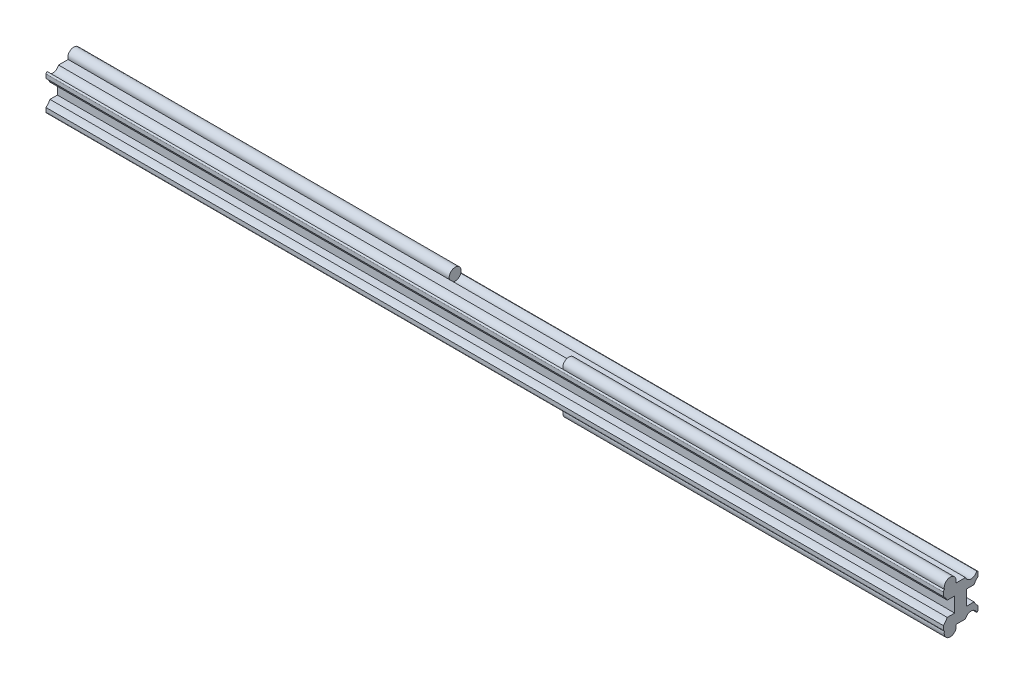
ISO-10303-21;
HEADER;
FILE_DESCRIPTION(('STEP AP214'),'2;1');
FILE_NAME('part.step','',(''),(''),'','','');
FILE_SCHEMA(('AUTOMOTIVE_DESIGN { 1 0 10303 214 1 1 1 1 }'));
ENDSEC;
DATA;
#1=APPLICATION_CONTEXT('core data for automotive mechanical design processes');
#2=APPLICATION_PROTOCOL_DEFINITION('international standard','automotive_design',2000,#1);
#3=PRODUCT_CONTEXT('',#1,'mechanical');
#4=PRODUCT('Part','Part','',(#3));
#5=PRODUCT_RELATED_PRODUCT_CATEGORY('part','',(#4));
#6=PRODUCT_DEFINITION_FORMATION('','',#4);
#7=PRODUCT_DEFINITION_CONTEXT('part definition',#1,'design');
#8=PRODUCT_DEFINITION('design','',#6,#7);
#9=PRODUCT_DEFINITION_SHAPE('','',#8);
#10=(LENGTH_UNIT() NAMED_UNIT(*) SI_UNIT(.MILLI.,.METRE.));
#11=(NAMED_UNIT(*) PLANE_ANGLE_UNIT() SI_UNIT($,.RADIAN.));
#12=(NAMED_UNIT(*) SI_UNIT($,.STERADIAN.) SOLID_ANGLE_UNIT());
#13=UNCERTAINTY_MEASURE_WITH_UNIT(LENGTH_MEASURE(1.E-05),#10,'distance_accuracy_value','');
#14=(GEOMETRIC_REPRESENTATION_CONTEXT(3) GLOBAL_UNCERTAINTY_ASSIGNED_CONTEXT((#13)) GLOBAL_UNIT_ASSIGNED_CONTEXT((#10,
#11,#12)) REPRESENTATION_CONTEXT('',''));
#15=CARTESIAN_POINT('',(0.,0.,0.));
#16=DIRECTION('',(0.,0.,1.));
#17=DIRECTION('',(1.,0.,0.));
#18=AXIS2_PLACEMENT_3D('',#15,#16,#17);
#19=CARTESIAN_POINT('',(40.,-6.65,3.5));
#20=DIRECTION('',(-1.,0.,0.));
#21=DIRECTION('',(0.,0.,1.));
#22=AXIS2_PLACEMENT_3D('',#19,#20,#21);
#23=CYLINDRICAL_SURFACE('',#22,2.);
#24=CARTESIAN_POINT('',(22.5,-6.65,3.5));
#25=DIRECTION('',(1.,0.,0.));
#26=DIRECTION('',(0.,0.,-1.));
#27=AXIS2_PLACEMENT_3D('',#24,#25,#26);
#28=CIRCLE('',#27,2.);
#29=CARTESIAN_POINT('',(22.5,-6.,1.60857196806222));
#30=VERTEX_POINT('',#29);
#31=CARTESIAN_POINT('',(22.5,-5.99207212544615,5.38868496893607));
#32=VERTEX_POINT('',#31);
#33=EDGE_CURVE('E31',#30,#32,#28,.T.);
#34=ORIENTED_EDGE('',*,*,#33,.T.);
#35=DIRECTION('',(-1.,0.,0.));
#36=VECTOR('',#35,1.);
#37=CARTESIAN_POINT('',(0.,-5.99207212544615,5.38868496893607));
#38=LINE('',#37,#36);
#39=CARTESIAN_POINT('',(-150.,-5.99207212544615,5.38868496893607));
#40=VERTEX_POINT('',#39);
#41=EDGE_CURVE('E219',#32,#40,#38,.T.);
#42=ORIENTED_EDGE('',*,*,#41,.T.);
#43=CARTESIAN_POINT('',(-150.,-6.65,3.5));
#44=DIRECTION('',(1.,0.,0.));
#45=DIRECTION('',(0.,0.,1.));
#46=AXIS2_PLACEMENT_3D('',#43,#44,#45);
#47=CIRCLE('',#46,2.);
#48=CARTESIAN_POINT('',(-150.,-6.,1.60857196806222));
#49=VERTEX_POINT('',#48);
#50=EDGE_CURVE('E260',#49,#40,#47,.T.);
#51=ORIENTED_EDGE('',*,*,#50,.F.);
#52=DIRECTION('',(-1.,0.,0.));
#53=VECTOR('',#52,1.);
#54=CARTESIAN_POINT('',(40.,-6.,1.60857196806222));
#55=LINE('',#54,#53);
#56=EDGE_CURVE('E320',#49,#30,#55,.F.);
#57=ORIENTED_EDGE('',*,*,#56,.T.);
#58=EDGE_LOOP('',(#34,#42,#51,#57));
#59=FACE_BOUND('',#58,.T.);
#60=ADVANCED_FACE('F16',(#59),#23,.F.);
#61=CARTESIAN_POINT('',(40.,6.65,3.5));
#62=DIRECTION('',(-1.,0.,0.));
#63=DIRECTION('',(0.,0.,1.));
#64=AXIS2_PLACEMENT_3D('',#61,#62,#63);
#65=CYLINDRICAL_SURFACE('',#64,2.);
#66=CARTESIAN_POINT('',(22.5,6.65,3.5));
#67=DIRECTION('',(1.,0.,0.));
#68=DIRECTION('',(0.,0.,-1.));
#69=AXIS2_PLACEMENT_3D('',#66,#67,#68);
#70=CIRCLE('',#69,2.);
#71=CARTESIAN_POINT('',(22.5,5.99207212544615,5.38868496893607));
#72=VERTEX_POINT('',#71);
#73=CARTESIAN_POINT('',(22.5,6.,1.60857196806223));
#74=VERTEX_POINT('',#73);
#75=EDGE_CURVE('E232',#72,#74,#70,.T.);
#76=ORIENTED_EDGE('',*,*,#75,.T.);
#77=DIRECTION('',(-1.,0.,0.));
#78=VECTOR('',#77,1.);
#79=CARTESIAN_POINT('',(40.,6.,1.60857196806223));
#80=LINE('',#79,#78);
#81=CARTESIAN_POINT('',(-150.,6.,1.60857196806223));
#82=VERTEX_POINT('',#81);
#83=EDGE_CURVE('E24',#74,#82,#80,.T.);
#84=ORIENTED_EDGE('',*,*,#83,.T.);
#85=CARTESIAN_POINT('',(-150.,6.65,3.5));
#86=DIRECTION('',(1.,0.,0.));
#87=DIRECTION('',(0.,0.,1.));
#88=AXIS2_PLACEMENT_3D('',#85,#86,#87);
#89=CIRCLE('',#88,2.);
#90=CARTESIAN_POINT('',(-150.,5.99207212544615,5.38868496893607));
#91=VERTEX_POINT('',#90);
#92=EDGE_CURVE('E290',#91,#82,#89,.T.);
#93=ORIENTED_EDGE('',*,*,#92,.F.);
#94=DIRECTION('',(-1.,0.,0.));
#95=VECTOR('',#94,1.);
#96=CARTESIAN_POINT('',(0.,5.99207212544615,5.38868496893607));
#97=LINE('',#96,#95);
#98=EDGE_CURVE('E384',#91,#72,#97,.F.);
#99=ORIENTED_EDGE('',*,*,#98,.T.);
#100=EDGE_LOOP('',(#76,#84,#93,#99));
#101=FACE_BOUND('',#100,.T.);
#102=ADVANCED_FACE('F489',(#101),#65,.F.);
#103=CARTESIAN_POINT('',(40.,-6.65,-3.5));
#104=DIRECTION('',(-1.,0.,0.));
#105=DIRECTION('',(0.,0.,1.));
#106=AXIS2_PLACEMENT_3D('',#103,#104,#105);
#107=CYLINDRICAL_SURFACE('',#106,2.);
#108=CARTESIAN_POINT('',(-22.5,-6.65,-3.5));
#109=DIRECTION('',(-1.,0.,0.));
#110=DIRECTION('',(0.,0.,1.));
#111=AXIS2_PLACEMENT_3D('',#108,#109,#110);
#112=CIRCLE('',#111,2.);
#113=CARTESIAN_POINT('',(-22.5,-6.,-1.60857196806223));
#114=VERTEX_POINT('',#113);
#115=CARTESIAN_POINT('',(-22.5,-5.99207212544615,-5.38868496893607));
#116=VERTEX_POINT('',#115);
#117=EDGE_CURVE('E241',#114,#116,#112,.T.);
#118=ORIENTED_EDGE('',*,*,#117,.T.);
#119=DIRECTION('',(-1.,0.,0.));
#120=VECTOR('',#119,1.);
#121=CARTESIAN_POINT('',(0.,-5.99207212544615,-5.38868496893607));
#122=LINE('',#121,#120);
#123=CARTESIAN_POINT('',(150.,-5.99207212544615,-5.38868496893607));
#124=VERTEX_POINT('',#123);
#125=EDGE_CURVE('E378',#116,#124,#122,.F.);
#126=ORIENTED_EDGE('',*,*,#125,.T.);
#127=CARTESIAN_POINT('',(150.,-6.65,-3.5));
#128=DIRECTION('',(1.,0.,0.));
#129=DIRECTION('',(0.,0.,1.));
#130=AXIS2_PLACEMENT_3D('',#127,#128,#129);
#131=CIRCLE('',#130,2.);
#132=CARTESIAN_POINT('',(150.,-6.,-1.60857196806223));
#133=VERTEX_POINT('',#132);
#134=EDGE_CURVE('E323',#124,#133,#131,.T.);
#135=ORIENTED_EDGE('',*,*,#134,.T.);
#136=DIRECTION('',(-1.,0.,0.));
#137=VECTOR('',#136,1.);
#138=CARTESIAN_POINT('',(40.,-6.,-1.60857196806223));
#139=LINE('',#138,#137);
#140=EDGE_CURVE('E419',#133,#114,#139,.T.);
#141=ORIENTED_EDGE('',*,*,#140,.T.);
#142=EDGE_LOOP('',(#118,#126,#135,#141));
#143=FACE_BOUND('',#142,.T.);
#144=ADVANCED_FACE('F494',(#143),#107,.F.);
#145=CARTESIAN_POINT('',(40.,6.65,-3.5));
#146=DIRECTION('',(-1.,0.,0.));
#147=DIRECTION('',(0.,0.,1.));
#148=AXIS2_PLACEMENT_3D('',#145,#146,#147);
#149=CYLINDRICAL_SURFACE('',#148,2.);
#150=CARTESIAN_POINT('',(-22.5,6.65,-3.5));
#151=DIRECTION('',(-1.,0.,0.));
#152=DIRECTION('',(0.,0.,1.));
#153=AXIS2_PLACEMENT_3D('',#150,#151,#152);
#154=CIRCLE('',#153,2.);
#155=CARTESIAN_POINT('',(-22.5,5.99207212544615,-5.38868496893607));
#156=VERTEX_POINT('',#155);
#157=CARTESIAN_POINT('',(-22.5,6.,-1.60857196806223));
#158=VERTEX_POINT('',#157);
#159=EDGE_CURVE('E247',#156,#158,#154,.T.);
#160=ORIENTED_EDGE('',*,*,#159,.T.);
#161=DIRECTION('',(-1.,0.,0.));
#162=VECTOR('',#161,1.);
#163=CARTESIAN_POINT('',(40.,6.,-1.60857196806223));
#164=LINE('',#163,#162);
#165=CARTESIAN_POINT('',(150.,6.,-1.60857196806223));
#166=VERTEX_POINT('',#165);
#167=EDGE_CURVE('E381',#158,#166,#164,.F.);
#168=ORIENTED_EDGE('',*,*,#167,.T.);
#169=CARTESIAN_POINT('',(150.,6.65,-3.5));
#170=DIRECTION('',(1.,0.,0.));
#171=DIRECTION('',(0.,0.,1.));
#172=AXIS2_PLACEMENT_3D('',#169,#170,#171);
#173=CIRCLE('',#172,2.);
#174=CARTESIAN_POINT('',(150.,5.99207212544615,-5.38868496893607));
#175=VERTEX_POINT('',#174);
#176=EDGE_CURVE('E351',#166,#175,#173,.T.);
#177=ORIENTED_EDGE('',*,*,#176,.T.);
#178=DIRECTION('',(-1.,0.,0.));
#179=VECTOR('',#178,1.);
#180=CARTESIAN_POINT('',(0.,5.99207212544615,-5.38868496893607));
#181=LINE('',#180,#179);
#182=EDGE_CURVE('E422',#175,#156,#181,.T.);
#183=ORIENTED_EDGE('',*,*,#182,.T.);
#184=EDGE_LOOP('',(#160,#168,#177,#183));
#185=FACE_BOUND('',#184,.T.);
#186=ADVANCED_FACE('F501',(#185),#149,.F.);
#187=CARTESIAN_POINT('',(-150.,-5.5,-5.3000000020087));
#188=DIRECTION('',(-1.,0.,0.));
#189=DIRECTION('',(0.,0.,1.));
#190=AXIS2_PLACEMENT_3D('',#187,#188,#189);
#191=PLANE('',#190);
#192=CARTESIAN_POINT('',(-150.,-5.5,-5.3000000020087));
#193=DIRECTION('',(-1.,0.,0.));
#194=DIRECTION('',(0.,0.,1.));
#195=AXIS2_PLACEMENT_3D('',#192,#193,#194);
#196=CIRCLE('',#195,0.5);
#197=CARTESIAN_POINT('',(-150.,-5.5,-5.8000000020087));
#198=VERTEX_POINT('',#197);
#199=CARTESIAN_POINT('',(-150.,-5.99207212544615,-5.38868496893607));
#200=VERTEX_POINT('',#199);
#201=EDGE_CURVE('E253',#198,#200,#196,.T.);
#202=ORIENTED_EDGE('',*,*,#201,.T.);
#203=CARTESIAN_POINT('',(-150.,-6.65,-3.5));
#204=DIRECTION('',(-1.,0.,0.));
#205=DIRECTION('',(0.,0.,1.));
#206=AXIS2_PLACEMENT_3D('',#203,#204,#205);
#207=CIRCLE('',#206,2.);
#208=CARTESIAN_POINT('',(-150.,-6.,-1.60857196806223));
#209=VERTEX_POINT('',#208);
#210=EDGE_CURVE('E240',#200,#209,#207,.T.);
#211=ORIENTED_EDGE('',*,*,#210,.T.);
#212=DIRECTION('',(0.,0.,1.));
#213=VECTOR('',#212,1.);
#214=CARTESIAN_POINT('',(-150.,-6.,-1.60857196806223));
#215=LINE('',#214,#213);
#216=EDGE_CURVE('E256',#209,#49,#215,.T.);
#217=ORIENTED_EDGE('',*,*,#216,.T.);
#218=ORIENTED_EDGE('',*,*,#50,.T.);
#219=CARTESIAN_POINT('',(-150.,-5.5,5.3000000020087));
#220=DIRECTION('',(-1.,0.,0.));
#221=DIRECTION('',(0.,0.,1.));
#222=AXIS2_PLACEMENT_3D('',#219,#220,#221);
#223=CIRCLE('',#222,0.5);
#224=CARTESIAN_POINT('',(-150.,-5.5,5.8000000020087));
#225=VERTEX_POINT('',#224);
#226=EDGE_CURVE('E263',#40,#225,#223,.T.);
#227=ORIENTED_EDGE('',*,*,#226,.T.);
#228=DIRECTION('',(0.,1.,0.));
#229=VECTOR('',#228,1.);
#230=CARTESIAN_POINT('',(-150.,-5.5,5.8000000020087));
#231=LINE('',#230,#229);
#232=CARTESIAN_POINT('',(-150.,-4.1995699145586,5.80000000200865));
#233=VERTEX_POINT('',#232);
#234=EDGE_CURVE('E266',#225,#233,#231,.T.);
#235=ORIENTED_EDGE('',*,*,#234,.T.);
#236=CARTESIAN_POINT('',(-150.,0.00400000029354697,9.49999999808304));
#237=DIRECTION('',(1.,0.,0.));
#238=DIRECTION('',(0.,0.,1.));
#239=AXIS2_PLACEMENT_3D('',#236,#237,#238);
#240=CIRCLE('',#239,5.6);
#241=CARTESIAN_POINT('',(-150.,-2.49600003169351,4.48901208749444));
#242=VERTEX_POINT('',#241);
#243=EDGE_CURVE('E269',#233,#242,#240,.T.);
#244=ORIENTED_EDGE('',*,*,#243,.T.);
#245=DIRECTION('',(0.,1.2851330311388E-08,-1.));
#246=VECTOR('',#245,1.);
#247=CARTESIAN_POINT('',(-150.,-2.49600003169351,4.48901208749444));
#248=LINE('',#247,#246);
#249=CARTESIAN_POINT('',(-150.,-2.4959999997064,1.99999999773326));
#250=VERTEX_POINT('',#249);
#251=EDGE_CURVE('E272',#242,#250,#248,.T.);
#252=ORIENTED_EDGE('',*,*,#251,.T.);
#253=DIRECTION('',(0.,1.,0.));
#254=VECTOR('',#253,1.);
#255=CARTESIAN_POINT('',(-150.,-2.4959999997064,1.99999999773326));
#256=LINE('',#255,#254);
#257=CARTESIAN_POINT('',(-150.,2.4959999997064,1.99999999773326));
#258=VERTEX_POINT('',#257);
#259=EDGE_CURVE('E275',#250,#258,#256,.T.);
#260=ORIENTED_EDGE('',*,*,#259,.T.);
#261=DIRECTION('',(0.,1.28513155011446E-08,1.));
#262=VECTOR('',#261,1.);
#263=CARTESIAN_POINT('',(-150.,2.4959999997064,1.99999999773326));
#264=LINE('',#263,#262);
#265=CARTESIAN_POINT('',(-150.,2.49600003169349,4.48901208749451));
#266=VERTEX_POINT('',#265);
#267=EDGE_CURVE('E278',#258,#266,#264,.T.);
#268=ORIENTED_EDGE('',*,*,#267,.T.);
#269=CARTESIAN_POINT('',(-150.,-0.00400000029354697,9.49999999808304));
#270=DIRECTION('',(1.,0.,0.));
#271=DIRECTION('',(0.,0.,1.));
#272=AXIS2_PLACEMENT_3D('',#269,#270,#271);
#273=CIRCLE('',#272,5.6);
#274=CARTESIAN_POINT('',(-150.,4.19956991455855,5.8000000020087));
#275=VERTEX_POINT('',#274);
#276=EDGE_CURVE('E281',#266,#275,#273,.T.);
#277=ORIENTED_EDGE('',*,*,#276,.T.);
#278=DIRECTION('',(0.,1.,0.));
#279=VECTOR('',#278,1.);
#280=CARTESIAN_POINT('',(-150.,4.19956991455855,5.8000000020087));
#281=LINE('',#280,#279);
#282=CARTESIAN_POINT('',(-150.,5.5,5.8000000020087));
#283=VERTEX_POINT('',#282);
#284=EDGE_CURVE('E284',#275,#283,#281,.T.);
#285=ORIENTED_EDGE('',*,*,#284,.T.);
#286=CARTESIAN_POINT('',(-150.,5.5,5.3000000020087));
#287=DIRECTION('',(-1.,0.,0.));
#288=DIRECTION('',(0.,0.,1.));
#289=AXIS2_PLACEMENT_3D('',#286,#287,#288);
#290=CIRCLE('',#289,0.5);
#291=EDGE_CURVE('E287',#283,#91,#290,.T.);
#292=ORIENTED_EDGE('',*,*,#291,.T.);
#293=ORIENTED_EDGE('',*,*,#92,.T.);
#294=DIRECTION('',(0.,0.,-1.));
#295=VECTOR('',#294,1.);
#296=CARTESIAN_POINT('',(-150.,6.,1.60857196806223));
#297=LINE('',#296,#295);
#298=CARTESIAN_POINT('',(-150.,6.,-1.60857196806223));
#299=VERTEX_POINT('',#298);
#300=EDGE_CURVE('E293',#82,#299,#297,.T.);
#301=ORIENTED_EDGE('',*,*,#300,.T.);
#302=CARTESIAN_POINT('',(-150.,6.65,-3.5));
#303=DIRECTION('',(-1.,0.,0.));
#304=DIRECTION('',(0.,0.,1.));
#305=AXIS2_PLACEMENT_3D('',#302,#303,#304);
#306=CIRCLE('',#305,2.);
#307=CARTESIAN_POINT('',(-150.,5.99207212544615,-5.38868496893607));
#308=VERTEX_POINT('',#307);
#309=EDGE_CURVE('E244',#299,#308,#306,.T.);
#310=ORIENTED_EDGE('',*,*,#309,.T.);
#311=CARTESIAN_POINT('',(-150.,5.5,-5.3000000020087));
#312=DIRECTION('',(-1.,0.,0.));
#313=DIRECTION('',(0.,0.,1.));
#314=AXIS2_PLACEMENT_3D('',#311,#312,#313);
#315=CIRCLE('',#314,0.5);
#316=CARTESIAN_POINT('',(-150.,5.5,-5.8000000020087));
#317=VERTEX_POINT('',#316);
#318=EDGE_CURVE('E296',#308,#317,#315,.T.);
#319=ORIENTED_EDGE('',*,*,#318,.T.);
#320=DIRECTION('',(0.,-1.,0.));
#321=VECTOR('',#320,1.);
#322=CARTESIAN_POINT('',(-150.,5.5,-5.8000000020087));
#323=LINE('',#322,#321);
#324=CARTESIAN_POINT('',(-150.,4.1995699145586,-5.80000000200865));
#325=VERTEX_POINT('',#324);
#326=EDGE_CURVE('E299',#317,#325,#323,.T.);
#327=ORIENTED_EDGE('',*,*,#326,.T.);
#328=CARTESIAN_POINT('',(-150.,-0.00400000029354697,-9.49999999808304));
#329=DIRECTION('',(1.,0.,0.));
#330=DIRECTION('',(0.,0.,1.));
#331=AXIS2_PLACEMENT_3D('',#328,#329,#330);
#332=CIRCLE('',#331,5.6);
#333=CARTESIAN_POINT('',(-150.,2.49600003169352,-4.48901208749445));
#334=VERTEX_POINT('',#333);
#335=EDGE_CURVE('E302',#325,#334,#332,.T.);
#336=ORIENTED_EDGE('',*,*,#335,.T.);
#337=DIRECTION('',(0.,-1.28513315310551E-08,1.));
#338=VECTOR('',#337,1.);
#339=CARTESIAN_POINT('',(-150.,2.49600003169352,-4.48901208749445));
#340=LINE('',#339,#338);
#341=CARTESIAN_POINT('',(-150.,2.4959999997064,-1.99999999773326));
#342=VERTEX_POINT('',#341);
#343=EDGE_CURVE('E305',#334,#342,#340,.T.);
#344=ORIENTED_EDGE('',*,*,#343,.T.);
#345=DIRECTION('',(0.,-1.,0.));
#346=VECTOR('',#345,1.);
#347=CARTESIAN_POINT('',(-150.,2.4959999997064,-1.99999999773326));
#348=LINE('',#347,#346);
#349=CARTESIAN_POINT('',(-150.,-2.4959999997064,-1.99999999773326));
#350=VERTEX_POINT('',#349);
#351=EDGE_CURVE('E308',#342,#350,#348,.T.);
#352=ORIENTED_EDGE('',*,*,#351,.T.);
#353=DIRECTION('',(0.,-1.28513155011446E-08,-1.));
#354=VECTOR('',#353,1.);
#355=CARTESIAN_POINT('',(-150.,-2.4959999997064,-1.99999999773326));
#356=LINE('',#355,#354);
#357=CARTESIAN_POINT('',(-150.,-2.49600003169349,-4.48901208749451));
#358=VERTEX_POINT('',#357);
#359=EDGE_CURVE('E311',#350,#358,#356,.T.);
#360=ORIENTED_EDGE('',*,*,#359,.T.);
#361=CARTESIAN_POINT('',(-150.,0.00400000029354697,-9.49999999808304));
#362=DIRECTION('',(1.,0.,0.));
#363=DIRECTION('',(0.,0.,1.));
#364=AXIS2_PLACEMENT_3D('',#361,#362,#363);
#365=CIRCLE('',#364,5.6);
#366=CARTESIAN_POINT('',(-150.,-4.19956991455855,-5.8000000020087));
#367=VERTEX_POINT('',#366);
#368=EDGE_CURVE('E314',#358,#367,#365,.T.);
#369=ORIENTED_EDGE('',*,*,#368,.T.);
#370=DIRECTION('',(0.,-1.,0.));
#371=VECTOR('',#370,1.);
#372=CARTESIAN_POINT('',(-150.,-4.19956991455855,-5.8000000020087));
#373=LINE('',#372,#371);
#374=EDGE_CURVE('E317',#367,#198,#373,.T.);
#375=ORIENTED_EDGE('',*,*,#374,.T.);
#376=EDGE_LOOP('',(#202,#211,#217,#218,#227,#235,#244,#252,#260,#268,#277,#285,#292,#293,#301,
#310,#319,#327,#336,#344,#352,#360,#369,#375));
#377=FACE_BOUND('',#376,.T.);
#378=ADVANCED_FACE('F437',(#377),#191,.T.);
#379=CARTESIAN_POINT('',(-40.,5.24599995322529,-5.80000000200872));
#380=DIRECTION('',(0.,0.,1.));
#381=DIRECTION('',(0.,1.,0.));
#382=AXIS2_PLACEMENT_3D('',#379,#380,#381);
#383=PLANE('',#382);
#384=DIRECTION('',(1.,0.,0.));
#385=VECTOR('',#384,1.);
#386=CARTESIAN_POINT('',(-40.,4.19956991455861,-5.80000000200864));
#387=LINE('',#386,#385);
#388=CARTESIAN_POINT('',(150.,4.1995699145586,-5.80000000200865));
#389=VERTEX_POINT('',#388);
#390=EDGE_CURVE('E417',#325,#389,#387,.T.);
#391=ORIENTED_EDGE('',*,*,#390,.F.);
#392=ORIENTED_EDGE('',*,*,#326,.F.);
#393=DIRECTION('',(-1.,0.,0.));
#394=VECTOR('',#393,1.);
#395=CARTESIAN_POINT('',(51.7056202401866,5.5,-5.8000000020087));
#396=LINE('',#395,#394);
#397=CARTESIAN_POINT('',(150.,5.5,-5.8000000020087));
#398=VERTEX_POINT('',#397);
#399=EDGE_CURVE('E392',#398,#317,#396,.T.);
#400=ORIENTED_EDGE('',*,*,#399,.F.);
#401=DIRECTION('',(0.,-1.,0.));
#402=VECTOR('',#401,1.);
#403=CARTESIAN_POINT('',(150.,5.5,-5.8000000020087));
#404=LINE('',#403,#402);
#405=EDGE_CURVE('E357',#398,#389,#404,.T.);
#406=ORIENTED_EDGE('',*,*,#405,.T.);
#407=EDGE_LOOP('',(#391,#392,#400,#406));
#408=FACE_BOUND('',#407,.T.);
#409=ADVANCED_FACE('F18',(#408),#383,.F.);
#410=CARTESIAN_POINT('',(-40.,-0.00400000029354697,-9.49999999808304));
#411=DIRECTION('',(1.,0.,0.));
#412=DIRECTION('',(0.,0.,-1.));
#413=AXIS2_PLACEMENT_3D('',#410,#411,#412);
#414=CYLINDRICAL_SURFACE('',#413,5.6);
#415=ORIENTED_EDGE('',*,*,#390,.T.);
#416=CARTESIAN_POINT('',(150.,-0.00400000029354697,-9.49999999808304));
#417=DIRECTION('',(1.,0.,0.));
#418=DIRECTION('',(0.,0.,1.));
#419=AXIS2_PLACEMENT_3D('',#416,#417,#418);
#420=CIRCLE('',#419,5.6);
#421=CARTESIAN_POINT('',(150.,2.49600003169352,-4.48901208749445));
#422=VERTEX_POINT('',#421);
#423=EDGE_CURVE('E360',#389,#422,#420,.T.);
#424=ORIENTED_EDGE('',*,*,#423,.T.);
#425=DIRECTION('',(1.,0.,0.));
#426=VECTOR('',#425,1.);
#427=CARTESIAN_POINT('',(-40.,2.49600003169351,-4.48901208749447));
#428=LINE('',#427,#426);
#429=EDGE_CURVE('E415',#334,#422,#428,.T.);
#430=ORIENTED_EDGE('',*,*,#429,.F.);
#431=ORIENTED_EDGE('',*,*,#335,.F.);
#432=EDGE_LOOP('',(#415,#424,#430,#431));
#433=FACE_BOUND('',#432,.T.);
#434=ADVANCED_FACE('F443',(#433),#414,.F.);
#435=CARTESIAN_POINT('',(-40.,2.49600003169348,-4.48901208749453));
#436=DIRECTION('',(0.,1.,1.28513155011446E-08));
#437=DIRECTION('',(0.,1.28513155011446E-08,-1.));
#438=AXIS2_PLACEMENT_3D('',#435,#436,#437);
#439=PLANE('',#438);
#440=ORIENTED_EDGE('',*,*,#429,.T.);
#441=DIRECTION('',(0.,-1.28513315310551E-08,1.));
#442=VECTOR('',#441,1.);
#443=CARTESIAN_POINT('',(150.,2.49600003169352,-4.48901208749445));
#444=LINE('',#443,#442);
#445=CARTESIAN_POINT('',(150.,2.4959999997064,-1.99999999773326));
#446=VERTEX_POINT('',#445);
#447=EDGE_CURVE('E363',#422,#446,#444,.T.);
#448=ORIENTED_EDGE('',*,*,#447,.T.);
#449=DIRECTION('',(1.,0.,0.));
#450=VECTOR('',#449,1.);
#451=CARTESIAN_POINT('',(-40.,2.4959999997064,-1.99999999773326));
#452=LINE('',#451,#450);
#453=EDGE_CURVE('E413',#342,#446,#452,.T.);
#454=ORIENTED_EDGE('',*,*,#453,.F.);
#455=ORIENTED_EDGE('',*,*,#343,.F.);
#456=EDGE_LOOP('',(#440,#448,#454,#455));
#457=FACE_BOUND('',#456,.T.);
#458=ADVANCED_FACE('F448',(#457),#439,.F.);
#459=CARTESIAN_POINT('',(-40.,2.4959999997064,-1.99999999773326));
#460=DIRECTION('',(0.,0.,1.));
#461=DIRECTION('',(1.,0.,0.));
#462=AXIS2_PLACEMENT_3D('',#459,#460,#461);
#463=PLANE('',#462);
#464=ORIENTED_EDGE('',*,*,#453,.T.);
#465=DIRECTION('',(0.,-1.,0.));
#466=VECTOR('',#465,1.);
#467=CARTESIAN_POINT('',(150.,2.4959999997064,-1.99999999773326));
#468=LINE('',#467,#466);
#469=CARTESIAN_POINT('',(150.,-2.4959999997064,-1.99999999773326));
#470=VERTEX_POINT('',#469);
#471=EDGE_CURVE('E366',#446,#470,#468,.T.);
#472=ORIENTED_EDGE('',*,*,#471,.T.);
#473=DIRECTION('',(1.,0.,0.));
#474=VECTOR('',#473,1.);
#475=CARTESIAN_POINT('',(-40.,-2.4959999997064,-1.99999999773326));
#476=LINE('',#475,#474);
#477=EDGE_CURVE('E411',#350,#470,#476,.T.);
#478=ORIENTED_EDGE('',*,*,#477,.F.);
#479=ORIENTED_EDGE('',*,*,#351,.F.);
#480=EDGE_LOOP('',(#464,#472,#478,#479));
#481=FACE_BOUND('',#480,.T.);
#482=ADVANCED_FACE('F451',(#481),#463,.F.);
#483=CARTESIAN_POINT('',(-40.,-2.49600003169348,-4.48901208749453));
#484=DIRECTION('',(0.,-1.,1.28513155011446E-08));
#485=DIRECTION('',(0.,1.28513155011446E-08,1.));
#486=AXIS2_PLACEMENT_3D('',#483,#484,#485);
#487=PLANE('',#486);
#488=ORIENTED_EDGE('',*,*,#477,.T.);
#489=DIRECTION('',(0.,-1.28513155011446E-08,-1.));
#490=VECTOR('',#489,1.);
#491=CARTESIAN_POINT('',(150.,-2.4959999997064,-1.99999999773326));
#492=LINE('',#491,#490);
#493=CARTESIAN_POINT('',(150.,-2.49600003169349,-4.48901208749451));
#494=VERTEX_POINT('',#493);
#495=EDGE_CURVE('E369',#470,#494,#492,.T.);
#496=ORIENTED_EDGE('',*,*,#495,.T.);
#497=DIRECTION('',(1.,0.,0.));
#498=VECTOR('',#497,1.);
#499=CARTESIAN_POINT('',(-40.,-2.49600003169348,-4.48901208749453));
#500=LINE('',#499,#498);
#501=EDGE_CURVE('E409',#358,#494,#500,.T.);
#502=ORIENTED_EDGE('',*,*,#501,.F.);
#503=ORIENTED_EDGE('',*,*,#359,.F.);
#504=EDGE_LOOP('',(#488,#496,#502,#503));
#505=FACE_BOUND('',#504,.T.);
#506=ADVANCED_FACE('F456',(#505),#487,.F.);
#507=CARTESIAN_POINT('',(-40.,0.00400000029354697,-9.49999999808304));
#508=DIRECTION('',(1.,0.,0.));
#509=DIRECTION('',(0.,0.,-1.));
#510=AXIS2_PLACEMENT_3D('',#507,#508,#509);
#511=CYLINDRICAL_SURFACE('',#510,5.6);
#512=ORIENTED_EDGE('',*,*,#501,.T.);
#513=CARTESIAN_POINT('',(150.,0.00400000029354697,-9.49999999808304));
#514=DIRECTION('',(1.,0.,0.));
#515=DIRECTION('',(0.,0.,1.));
#516=AXIS2_PLACEMENT_3D('',#513,#514,#515);
#517=CIRCLE('',#516,5.6);
#518=CARTESIAN_POINT('',(150.,-4.19956991455855,-5.8000000020087));
#519=VERTEX_POINT('',#518);
#520=EDGE_CURVE('E372',#494,#519,#517,.T.);
#521=ORIENTED_EDGE('',*,*,#520,.T.);
#522=DIRECTION('',(1.,0.,0.));
#523=VECTOR('',#522,1.);
#524=CARTESIAN_POINT('',(-40.,-4.19956991455857,-5.80000000200868));
#525=LINE('',#524,#523);
#526=EDGE_CURVE('E407',#367,#519,#525,.T.);
#527=ORIENTED_EDGE('',*,*,#526,.F.);
#528=ORIENTED_EDGE('',*,*,#368,.F.);
#529=EDGE_LOOP('',(#512,#521,#527,#528));
#530=FACE_BOUND('',#529,.T.);
#531=ADVANCED_FACE('F459',(#530),#511,.F.);
#532=CARTESIAN_POINT('',(-40.,-5.24599995322529,-5.80000000200872));
#533=DIRECTION('',(0.,0.,1.));
#534=DIRECTION('',(0.,1.,0.));
#535=AXIS2_PLACEMENT_3D('',#532,#533,#534);
#536=PLANE('',#535);
#537=ORIENTED_EDGE('',*,*,#526,.T.);
#538=DIRECTION('',(0.,-1.,0.));
#539=VECTOR('',#538,1.);
#540=CARTESIAN_POINT('',(150.,-4.19956991455855,-5.8000000020087));
#541=LINE('',#540,#539);
#542=CARTESIAN_POINT('',(150.,-5.5,-5.8000000020087));
#543=VERTEX_POINT('',#542);
#544=EDGE_CURVE('E257',#519,#543,#541,.T.);
#545=ORIENTED_EDGE('',*,*,#544,.T.);
#546=DIRECTION('',(-1.,0.,0.));
#547=VECTOR('',#546,1.);
#548=CARTESIAN_POINT('',(51.7056202401866,-5.5,-5.8000000020087));
#549=LINE('',#548,#547);
#550=EDGE_CURVE('E387',#543,#198,#549,.T.);
#551=ORIENTED_EDGE('',*,*,#550,.T.);
#552=ORIENTED_EDGE('',*,*,#374,.F.);
#553=EDGE_LOOP('',(#537,#545,#551,#552));
#554=FACE_BOUND('',#553,.T.);
#555=ADVANCED_FACE('F464',(#554),#536,.F.);
#556=CARTESIAN_POINT('',(-40.,-5.24599995322529,5.80000000200872));
#557=DIRECTION('',(0.,0.,-1.));
#558=DIRECTION('',(0.,-1.,0.));
#559=AXIS2_PLACEMENT_3D('',#556,#557,#558);
#560=PLANE('',#559);
#561=DIRECTION('',(1.,0.,0.));
#562=VECTOR('',#561,1.);
#563=CARTESIAN_POINT('',(-40.,-4.19956991455861,5.80000000200864));
#564=LINE('',#563,#562);
#565=CARTESIAN_POINT('',(150.,-4.1995699145586,5.80000000200865));
#566=VERTEX_POINT('',#565);
#567=EDGE_CURVE('E405',#233,#566,#564,.T.);
#568=ORIENTED_EDGE('',*,*,#567,.F.);
#569=ORIENTED_EDGE('',*,*,#234,.F.);
#570=DIRECTION('',(-1.,0.,0.));
#571=VECTOR('',#570,1.);
#572=CARTESIAN_POINT('',(51.7056202401866,-5.5,5.8000000020087));
#573=LINE('',#572,#571);
#574=CARTESIAN_POINT('',(150.,-5.5,5.8000000020087));
#575=VERTEX_POINT('',#574);
#576=EDGE_CURVE('E389',#575,#225,#573,.T.);
#577=ORIENTED_EDGE('',*,*,#576,.F.);
#578=DIRECTION('',(0.,1.,0.));
#579=VECTOR('',#578,1.);
#580=CARTESIAN_POINT('',(150.,-5.5,5.8000000020087));
#581=LINE('',#580,#579);
#582=EDGE_CURVE('E211',#575,#566,#581,.T.);
#583=ORIENTED_EDGE('',*,*,#582,.T.);
#584=EDGE_LOOP('',(#568,#569,#577,#583));
#585=FACE_BOUND('',#584,.T.);
#586=ADVANCED_FACE('F544',(#585),#560,.F.);
#587=CARTESIAN_POINT('',(-40.,0.00400000029354697,9.49999999808304));
#588=DIRECTION('',(1.,0.,0.));
#589=DIRECTION('',(0.,0.,-1.));
#590=AXIS2_PLACEMENT_3D('',#587,#588,#589);
#591=CYLINDRICAL_SURFACE('',#590,5.6);
#592=ORIENTED_EDGE('',*,*,#567,.T.);
#593=CARTESIAN_POINT('',(150.,0.00400000029354697,9.49999999808304));
#594=DIRECTION('',(1.,0.,0.));
#595=DIRECTION('',(0.,0.,1.));
#596=AXIS2_PLACEMENT_3D('',#593,#594,#595);
#597=CIRCLE('',#596,5.6);
#598=CARTESIAN_POINT('',(150.,-2.49600003169351,4.48901208749444));
#599=VERTEX_POINT('',#598);
#600=EDGE_CURVE('E328',#566,#599,#597,.T.);
#601=ORIENTED_EDGE('',*,*,#600,.T.);
#602=DIRECTION('',(1.,0.,0.));
#603=VECTOR('',#602,1.);
#604=CARTESIAN_POINT('',(-40.,-2.49600003169351,4.48901208749447));
#605=LINE('',#604,#603);
#606=EDGE_CURVE('E403',#242,#599,#605,.T.);
#607=ORIENTED_EDGE('',*,*,#606,.F.);
#608=ORIENTED_EDGE('',*,*,#243,.F.);
#609=EDGE_LOOP('',(#592,#601,#607,#608));
#610=FACE_BOUND('',#609,.T.);
#611=ADVANCED_FACE('F540',(#610),#591,.F.);
#612=CARTESIAN_POINT('',(-40.,-2.49600003169348,4.48901208749453));
#613=DIRECTION('',(0.,-1.,-1.28513155011446E-08));
#614=DIRECTION('',(0.,-1.28513155011446E-08,1.));
#615=AXIS2_PLACEMENT_3D('',#612,#613,#614);
#616=PLANE('',#615);
#617=ORIENTED_EDGE('',*,*,#606,.T.);
#618=DIRECTION('',(0.,1.2851330311388E-08,-1.));
#619=VECTOR('',#618,1.);
#620=CARTESIAN_POINT('',(150.,-2.49600003169351,4.48901208749444));
#621=LINE('',#620,#619);
#622=CARTESIAN_POINT('',(150.,-2.4959999997064,1.99999999773326));
#623=VERTEX_POINT('',#622);
#624=EDGE_CURVE('E331',#599,#623,#621,.T.);
#625=ORIENTED_EDGE('',*,*,#624,.T.);
#626=DIRECTION('',(1.,0.,0.));
#627=VECTOR('',#626,1.);
#628=CARTESIAN_POINT('',(-40.,-2.4959999997064,1.99999999773326));
#629=LINE('',#628,#627);
#630=EDGE_CURVE('E401',#250,#623,#629,.T.);
#631=ORIENTED_EDGE('',*,*,#630,.F.);
#632=ORIENTED_EDGE('',*,*,#251,.F.);
#633=EDGE_LOOP('',(#617,#625,#631,#632));
#634=FACE_BOUND('',#633,.T.);
#635=ADVANCED_FACE('F536',(#634),#616,.F.);
#636=CARTESIAN_POINT('',(-40.,2.4959999997064,1.99999999773326));
#637=DIRECTION('',(0.,0.,-1.));
#638=DIRECTION('',(-1.,0.,0.));
#639=AXIS2_PLACEMENT_3D('',#636,#637,#638);
#640=PLANE('',#639);
#641=ORIENTED_EDGE('',*,*,#630,.T.);
#642=DIRECTION('',(0.,1.,0.));
#643=VECTOR('',#642,1.);
#644=CARTESIAN_POINT('',(150.,-2.4959999997064,1.99999999773326));
#645=LINE('',#644,#643);
#646=CARTESIAN_POINT('',(150.,2.4959999997064,1.99999999773326));
#647=VERTEX_POINT('',#646);
#648=EDGE_CURVE('E334',#623,#647,#645,.T.);
#649=ORIENTED_EDGE('',*,*,#648,.T.);
#650=DIRECTION('',(1.,0.,0.));
#651=VECTOR('',#650,1.);
#652=CARTESIAN_POINT('',(-40.,2.4959999997064,1.99999999773326));
#653=LINE('',#652,#651);
#654=EDGE_CURVE('E399',#258,#647,#653,.T.);
#655=ORIENTED_EDGE('',*,*,#654,.F.);
#656=ORIENTED_EDGE('',*,*,#259,.F.);
#657=EDGE_LOOP('',(#641,#649,#655,#656));
#658=FACE_BOUND('',#657,.T.);
#659=ADVANCED_FACE('F532',(#658),#640,.F.);
#660=CARTESIAN_POINT('',(-40.,2.49600003169348,4.48901208749453));
#661=DIRECTION('',(0.,1.,-1.28513155011446E-08));
#662=DIRECTION('',(0.,-1.28513155011446E-08,-1.));
#663=AXIS2_PLACEMENT_3D('',#660,#661,#662);
#664=PLANE('',#663);
#665=ORIENTED_EDGE('',*,*,#654,.T.);
#666=DIRECTION('',(0.,1.28513155011446E-08,1.));
#667=VECTOR('',#666,1.);
#668=CARTESIAN_POINT('',(150.,2.4959999997064,1.99999999773326));
#669=LINE('',#668,#667);
#670=CARTESIAN_POINT('',(150.,2.49600003169349,4.48901208749451));
#671=VERTEX_POINT('',#670);
#672=EDGE_CURVE('E337',#647,#671,#669,.T.);
#673=ORIENTED_EDGE('',*,*,#672,.T.);
#674=DIRECTION('',(1.,0.,0.));
#675=VECTOR('',#674,1.);
#676=CARTESIAN_POINT('',(-40.,2.49600003169348,4.48901208749453));
#677=LINE('',#676,#675);
#678=EDGE_CURVE('E397',#266,#671,#677,.T.);
#679=ORIENTED_EDGE('',*,*,#678,.F.);
#680=ORIENTED_EDGE('',*,*,#267,.F.);
#681=EDGE_LOOP('',(#665,#673,#679,#680));
#682=FACE_BOUND('',#681,.T.);
#683=ADVANCED_FACE('F528',(#682),#664,.F.);
#684=CARTESIAN_POINT('',(-40.,-0.00400000029354697,9.49999999808304));
#685=DIRECTION('',(1.,0.,0.));
#686=DIRECTION('',(0.,0.,-1.));
#687=AXIS2_PLACEMENT_3D('',#684,#685,#686);
#688=CYLINDRICAL_SURFACE('',#687,5.6);
#689=ORIENTED_EDGE('',*,*,#678,.T.);
#690=CARTESIAN_POINT('',(150.,-0.00400000029354697,9.49999999808304));
#691=DIRECTION('',(1.,0.,0.));
#692=DIRECTION('',(0.,0.,1.));
#693=AXIS2_PLACEMENT_3D('',#690,#691,#692);
#694=CIRCLE('',#693,5.6);
#695=CARTESIAN_POINT('',(150.,4.19956991455855,5.8000000020087));
#696=VERTEX_POINT('',#695);
#697=EDGE_CURVE('E340',#671,#696,#694,.T.);
#698=ORIENTED_EDGE('',*,*,#697,.T.);
#699=DIRECTION('',(1.,0.,0.));
#700=VECTOR('',#699,1.);
#701=CARTESIAN_POINT('',(-40.,4.19956991455857,5.80000000200868));
#702=LINE('',#701,#700);
#703=EDGE_CURVE('E394',#275,#696,#702,.T.);
#704=ORIENTED_EDGE('',*,*,#703,.F.);
#705=ORIENTED_EDGE('',*,*,#276,.F.);
#706=EDGE_LOOP('',(#689,#698,#704,#705));
#707=FACE_BOUND('',#706,.T.);
#708=ADVANCED_FACE('F524',(#707),#688,.F.);
#709=CARTESIAN_POINT('',(-40.,5.24599995322529,5.80000000200872));
#710=DIRECTION('',(0.,0.,-1.));
#711=DIRECTION('',(0.,-1.,0.));
#712=AXIS2_PLACEMENT_3D('',#709,#710,#711);
#713=PLANE('',#712);
#714=ORIENTED_EDGE('',*,*,#703,.T.);
#715=DIRECTION('',(0.,1.,0.));
#716=VECTOR('',#715,1.);
#717=CARTESIAN_POINT('',(150.,4.19956991455855,5.8000000020087));
#718=LINE('',#717,#716);
#719=CARTESIAN_POINT('',(150.,5.5,5.8000000020087));
#720=VERTEX_POINT('',#719);
#721=EDGE_CURVE('E343',#696,#720,#718,.T.);
#722=ORIENTED_EDGE('',*,*,#721,.T.);
#723=DIRECTION('',(-1.,0.,0.));
#724=VECTOR('',#723,1.);
#725=CARTESIAN_POINT('',(51.7056202401866,5.5,5.8000000020087));
#726=LINE('',#725,#724);
#727=EDGE_CURVE('E391',#720,#283,#726,.T.);
#728=ORIENTED_EDGE('',*,*,#727,.T.);
#729=ORIENTED_EDGE('',*,*,#284,.F.);
#730=EDGE_LOOP('',(#714,#722,#728,#729));
#731=FACE_BOUND('',#730,.T.);
#732=ADVANCED_FACE('F520',(#731),#713,.F.);
#733=CARTESIAN_POINT('',(51.7056202401866,5.5,5.3000000020087));
#734=DIRECTION('',(-1.,0.,0.));
#735=DIRECTION('',(0.,0.,1.));
#736=AXIS2_PLACEMENT_3D('',#733,#734,#735);
#737=CYLINDRICAL_SURFACE('',#736,0.5);
#738=ORIENTED_EDGE('',*,*,#98,.F.);
#739=ORIENTED_EDGE('',*,*,#291,.F.);
#740=ORIENTED_EDGE('',*,*,#727,.F.);
#741=CARTESIAN_POINT('',(150.,5.5,5.3000000020087));
#742=DIRECTION('',(-1.,0.,0.));
#743=DIRECTION('',(0.,0.,1.));
#744=AXIS2_PLACEMENT_3D('',#741,#742,#743);
#745=CIRCLE('',#744,0.5);
#746=CARTESIAN_POINT('',(150.,5.99207212544615,5.38868496893607));
#747=VERTEX_POINT('',#746);
#748=EDGE_CURVE('E346',#720,#747,#745,.T.);
#749=ORIENTED_EDGE('',*,*,#748,.T.);
#750=DIRECTION('',(1.,0.,0.));
#751=VECTOR('',#750,1.);
#752=CARTESIAN_POINT('',(86.25,5.99207212544615,5.38868496893607));
#753=LINE('',#752,#751);
#754=EDGE_CURVE('E234',#72,#747,#753,.T.);
#755=ORIENTED_EDGE('',*,*,#754,.F.);
#756=EDGE_LOOP('',(#738,#739,#740,#749,#755));
#757=FACE_BOUND('',#756,.T.);
#758=ADVANCED_FACE('F516',(#757),#737,.T.);
#759=CARTESIAN_POINT('',(51.7056202401866,6.,-5.3000000020087));
#760=DIRECTION('',(0.,1.,0.));
#761=DIRECTION('',(-1.,0.,0.));
#762=AXIS2_PLACEMENT_3D('',#759,#760,#761);
#763=PLANE('',#762);
#764=CARTESIAN_POINT('',(150.,6.,1.60857196806223));
#765=VERTEX_POINT('',#764);
#766=EDGE_CURVE('E11',#765,#74,#80,.T.);
#767=ORIENTED_EDGE('',*,*,#766,.F.);
#768=DIRECTION('',(0.,0.,-1.));
#769=VECTOR('',#768,1.);
#770=CARTESIAN_POINT('',(150.,6.,1.60857196806223));
#771=LINE('',#770,#769);
#772=EDGE_CURVE('E348',#765,#166,#771,.T.);
#773=ORIENTED_EDGE('',*,*,#772,.T.);
#774=ORIENTED_EDGE('',*,*,#167,.F.);
#775=EDGE_CURVE('E382',#299,#158,#164,.F.);
#776=ORIENTED_EDGE('',*,*,#775,.F.);
#777=ORIENTED_EDGE('',*,*,#300,.F.);
#778=ORIENTED_EDGE('',*,*,#83,.F.);
#779=EDGE_LOOP('',(#767,#773,#774,#776,#777,#778));
#780=FACE_BOUND('',#779,.T.);
#781=ADVANCED_FACE('F513',(#780),#763,.T.);
#782=CARTESIAN_POINT('',(51.7056202401866,5.5,-5.3000000020087));
#783=DIRECTION('',(-1.,0.,0.));
#784=DIRECTION('',(0.,0.,1.));
#785=AXIS2_PLACEMENT_3D('',#782,#783,#784);
#786=CYLINDRICAL_SURFACE('',#785,0.5);
#787=ORIENTED_EDGE('',*,*,#182,.F.);
#788=CARTESIAN_POINT('',(150.,5.5,-5.3000000020087));
#789=DIRECTION('',(-1.,0.,0.));
#790=DIRECTION('',(0.,0.,1.));
#791=AXIS2_PLACEMENT_3D('',#788,#789,#790);
#792=CIRCLE('',#791,0.5);
#793=EDGE_CURVE('E354',#175,#398,#792,.T.);
#794=ORIENTED_EDGE('',*,*,#793,.T.);
#795=ORIENTED_EDGE('',*,*,#399,.T.);
#796=ORIENTED_EDGE('',*,*,#318,.F.);
#797=EDGE_CURVE('E421',#156,#308,#181,.T.);
#798=ORIENTED_EDGE('',*,*,#797,.F.);
#799=EDGE_LOOP('',(#787,#794,#795,#796,#798));
#800=FACE_BOUND('',#799,.T.);
#801=ADVANCED_FACE('F434',(#800),#786,.T.);
#802=CARTESIAN_POINT('',(51.7056202401866,-5.5,-5.3000000020087));
#803=DIRECTION('',(-1.,0.,0.));
#804=DIRECTION('',(0.,0.,1.));
#805=AXIS2_PLACEMENT_3D('',#802,#803,#804);
#806=CYLINDRICAL_SURFACE('',#805,0.5);
#807=EDGE_CURVE('E379',#200,#116,#122,.F.);
#808=ORIENTED_EDGE('',*,*,#807,.F.);
#809=ORIENTED_EDGE('',*,*,#201,.F.);
#810=ORIENTED_EDGE('',*,*,#550,.F.);
#811=CARTESIAN_POINT('',(150.,-5.5,-5.3000000020087));
#812=DIRECTION('',(-1.,0.,0.));
#813=DIRECTION('',(0.,0.,1.));
#814=AXIS2_PLACEMENT_3D('',#811,#812,#813);
#815=CIRCLE('',#814,0.5);
#816=EDGE_CURVE('E250',#543,#124,#815,.T.);
#817=ORIENTED_EDGE('',*,*,#816,.T.);
#818=ORIENTED_EDGE('',*,*,#125,.F.);
#819=EDGE_LOOP('',(#808,#809,#810,#817,#818));
#820=FACE_BOUND('',#819,.T.);
#821=ADVANCED_FACE('F467',(#820),#806,.T.);
#822=CARTESIAN_POINT('',(51.7056202401866,-6.,-5.3000000020087));
#823=DIRECTION('',(0.,-1.,0.));
#824=DIRECTION('',(1.,0.,0.));
#825=AXIS2_PLACEMENT_3D('',#822,#823,#824);
#826=PLANE('',#825);
#827=ORIENTED_EDGE('',*,*,#140,.F.);
#828=DIRECTION('',(0.,0.,1.));
#829=VECTOR('',#828,1.);
#830=CARTESIAN_POINT('',(150.,-6.,-1.60857196806223));
#831=LINE('',#830,#829);
#832=CARTESIAN_POINT('',(150.,-6.,1.60857196806222));
#833=VERTEX_POINT('',#832);
#834=EDGE_CURVE('E213',#133,#833,#831,.T.);
#835=ORIENTED_EDGE('',*,*,#834,.T.);
#836=DIRECTION('',(1.,0.,0.));
#837=VECTOR('',#836,1.);
#838=CARTESIAN_POINT('',(22.5,-6.,1.60857196806222));
#839=LINE('',#838,#837);
#840=EDGE_CURVE('E39',#30,#833,#839,.T.);
#841=ORIENTED_EDGE('',*,*,#840,.F.);
#842=ORIENTED_EDGE('',*,*,#56,.F.);
#843=ORIENTED_EDGE('',*,*,#216,.F.);
#844=EDGE_CURVE('E223',#114,#209,#139,.T.);
#845=ORIENTED_EDGE('',*,*,#844,.F.);
#846=EDGE_LOOP('',(#827,#835,#841,#842,#843,#845));
#847=FACE_BOUND('',#846,.T.);
#848=ADVANCED_FACE('F477',(#847),#826,.T.);
#849=CARTESIAN_POINT('',(51.7056202401866,-5.5,5.3000000020087));
#850=DIRECTION('',(-1.,0.,0.));
#851=DIRECTION('',(0.,0.,1.));
#852=AXIS2_PLACEMENT_3D('',#849,#850,#851);
#853=CYLINDRICAL_SURFACE('',#852,0.5);
#854=CARTESIAN_POINT('',(150.,-5.99207212544615,5.38868496893607));
#855=VERTEX_POINT('',#854);
#856=EDGE_CURVE('E216',#855,#32,#38,.T.);
#857=ORIENTED_EDGE('',*,*,#856,.F.);
#858=CARTESIAN_POINT('',(150.,-5.5,5.3000000020087));
#859=DIRECTION('',(-1.,0.,0.));
#860=DIRECTION('',(0.,0.,1.));
#861=AXIS2_PLACEMENT_3D('',#858,#859,#860);
#862=CIRCLE('',#861,0.5);
#863=EDGE_CURVE('E202',#855,#575,#862,.T.);
#864=ORIENTED_EDGE('',*,*,#863,.T.);
#865=ORIENTED_EDGE('',*,*,#576,.T.);
#866=ORIENTED_EDGE('',*,*,#226,.F.);
#867=ORIENTED_EDGE('',*,*,#41,.F.);
#868=EDGE_LOOP('',(#857,#864,#865,#866,#867));
#869=FACE_BOUND('',#868,.T.);
#870=ADVANCED_FACE('F217',(#869),#853,.T.);
#871=CARTESIAN_POINT('',(150.,-5.5,-5.3000000020087));
#872=DIRECTION('',(-1.,0.,0.));
#873=DIRECTION('',(0.,0.,1.));
#874=AXIS2_PLACEMENT_3D('',#871,#872,#873);
#875=PLANE('',#874);
#876=ORIENTED_EDGE('',*,*,#816,.F.);
#877=ORIENTED_EDGE('',*,*,#544,.F.);
#878=ORIENTED_EDGE('',*,*,#520,.F.);
#879=ORIENTED_EDGE('',*,*,#495,.F.);
#880=ORIENTED_EDGE('',*,*,#471,.F.);
#881=ORIENTED_EDGE('',*,*,#447,.F.);
#882=ORIENTED_EDGE('',*,*,#423,.F.);
#883=ORIENTED_EDGE('',*,*,#405,.F.);
#884=ORIENTED_EDGE('',*,*,#793,.F.);
#885=ORIENTED_EDGE('',*,*,#176,.F.);
#886=ORIENTED_EDGE('',*,*,#772,.F.);
#887=CARTESIAN_POINT('',(150.,6.65,3.5));
#888=DIRECTION('',(1.,0.,0.));
#889=DIRECTION('',(0.,0.,-1.));
#890=AXIS2_PLACEMENT_3D('',#887,#888,#889);
#891=CIRCLE('',#890,2.);
#892=EDGE_CURVE('E231',#765,#747,#891,.T.);
#893=ORIENTED_EDGE('',*,*,#892,.T.);
#894=ORIENTED_EDGE('',*,*,#748,.F.);
#895=ORIENTED_EDGE('',*,*,#721,.F.);
#896=ORIENTED_EDGE('',*,*,#697,.F.);
#897=ORIENTED_EDGE('',*,*,#672,.F.);
#898=ORIENTED_EDGE('',*,*,#648,.F.);
#899=ORIENTED_EDGE('',*,*,#624,.F.);
#900=ORIENTED_EDGE('',*,*,#600,.F.);
#901=ORIENTED_EDGE('',*,*,#582,.F.);
#902=ORIENTED_EDGE('',*,*,#863,.F.);
#903=CARTESIAN_POINT('',(150.,-6.65,3.5));
#904=DIRECTION('',(1.,0.,0.));
#905=DIRECTION('',(0.,0.,-1.));
#906=AXIS2_PLACEMENT_3D('',#903,#904,#905);
#907=CIRCLE('',#906,2.);
#908=EDGE_CURVE('E208',#855,#833,#907,.T.);
#909=ORIENTED_EDGE('',*,*,#908,.T.);
#910=ORIENTED_EDGE('',*,*,#834,.F.);
#911=ORIENTED_EDGE('',*,*,#134,.F.);
#912=EDGE_LOOP('',(#876,#877,#878,#879,#880,#881,#882,#883,#884,#885,#886,#893,#894,#895,#896,
#897,#898,#899,#900,#901,#902,#909,#910,#911));
#913=FACE_BOUND('',#912,.T.);
#914=ADVANCED_FACE('F205',(#913),#875,.F.);
#915=CARTESIAN_POINT('',(-22.5,6.65,-3.5));
#916=DIRECTION('',(-1.,0.,0.));
#917=DIRECTION('',(0.,0.,1.));
#918=AXIS2_PLACEMENT_3D('',#915,#916,#917);
#919=CYLINDRICAL_SURFACE('',#918,2.);
#920=ORIENTED_EDGE('',*,*,#309,.F.);
#921=ORIENTED_EDGE('',*,*,#775,.T.);
#922=EDGE_CURVE('E251',#158,#156,#154,.T.);
#923=ORIENTED_EDGE('',*,*,#922,.T.);
#924=ORIENTED_EDGE('',*,*,#797,.T.);
#925=EDGE_LOOP('',(#920,#921,#923,#924));
#926=FACE_BOUND('',#925,.T.);
#927=ADVANCED_FACE('F429',(#926),#919,.T.);
#928=CARTESIAN_POINT('',(-22.5,6.65,-3.5));
#929=DIRECTION('',(-1.,0.,0.));
#930=DIRECTION('',(0.,0.,1.));
#931=AXIS2_PLACEMENT_3D('',#928,#929,#930);
#932=PLANE('',#931);
#933=ORIENTED_EDGE('',*,*,#159,.F.);
#934=ORIENTED_EDGE('',*,*,#922,.F.);
#935=EDGE_LOOP('',(#933,#934));
#936=FACE_BOUND('',#935,.T.);
#937=ADVANCED_FACE('F574',(#936),#932,.F.);
#938=CARTESIAN_POINT('',(-22.5,-6.65,-3.5));
#939=DIRECTION('',(-1.,0.,0.));
#940=DIRECTION('',(0.,0.,1.));
#941=AXIS2_PLACEMENT_3D('',#938,#939,#940);
#942=CYLINDRICAL_SURFACE('',#941,2.);
#943=ORIENTED_EDGE('',*,*,#210,.F.);
#944=ORIENTED_EDGE('',*,*,#807,.T.);
#945=EDGE_CURVE('E245',#116,#114,#112,.T.);
#946=ORIENTED_EDGE('',*,*,#945,.T.);
#947=ORIENTED_EDGE('',*,*,#844,.T.);
#948=EDGE_LOOP('',(#943,#944,#946,#947));
#949=FACE_BOUND('',#948,.T.);
#950=ADVANCED_FACE('F474',(#949),#942,.T.);
#951=CARTESIAN_POINT('',(-22.5,-6.65,-3.5));
#952=DIRECTION('',(-1.,0.,0.));
#953=DIRECTION('',(0.,0.,1.));
#954=AXIS2_PLACEMENT_3D('',#951,#952,#953);
#955=PLANE('',#954);
#956=ORIENTED_EDGE('',*,*,#117,.F.);
#957=ORIENTED_EDGE('',*,*,#945,.F.);
#958=EDGE_LOOP('',(#956,#957));
#959=FACE_BOUND('',#958,.T.);
#960=ADVANCED_FACE('F582',(#959),#955,.F.);
#961=CARTESIAN_POINT('',(22.5,6.65,3.5));
#962=DIRECTION('',(1.,0.,0.));
#963=DIRECTION('',(0.,0.,-1.));
#964=AXIS2_PLACEMENT_3D('',#961,#962,#963);
#965=CYLINDRICAL_SURFACE('',#964,2.);
#966=EDGE_CURVE('E235',#74,#72,#70,.T.);
#967=ORIENTED_EDGE('',*,*,#966,.T.);
#968=ORIENTED_EDGE('',*,*,#754,.T.);
#969=ORIENTED_EDGE('',*,*,#892,.F.);
#970=ORIENTED_EDGE('',*,*,#766,.T.);
#971=EDGE_LOOP('',(#967,#968,#969,#970));
#972=FACE_BOUND('',#971,.T.);
#973=ADVANCED_FACE('F587',(#972),#965,.T.);
#974=CARTESIAN_POINT('',(22.5,6.65,3.5));
#975=DIRECTION('',(1.,0.,0.));
#976=DIRECTION('',(0.,0.,-1.));
#977=AXIS2_PLACEMENT_3D('',#974,#975,#976);
#978=PLANE('',#977);
#979=ORIENTED_EDGE('',*,*,#75,.F.);
#980=ORIENTED_EDGE('',*,*,#966,.F.);
#981=EDGE_LOOP('',(#979,#980));
#982=FACE_BOUND('',#981,.T.);
#983=ADVANCED_FACE('F486',(#982),#978,.F.);
#984=CARTESIAN_POINT('',(22.5,-6.65,3.5));
#985=DIRECTION('',(1.,0.,0.));
#986=DIRECTION('',(0.,0.,-1.));
#987=AXIS2_PLACEMENT_3D('',#984,#985,#986);
#988=CYLINDRICAL_SURFACE('',#987,2.);
#989=EDGE_CURVE('E226',#32,#30,#28,.T.);
#990=ORIENTED_EDGE('',*,*,#989,.T.);
#991=ORIENTED_EDGE('',*,*,#840,.T.);
#992=ORIENTED_EDGE('',*,*,#908,.F.);
#993=ORIENTED_EDGE('',*,*,#856,.T.);
#994=EDGE_LOOP('',(#990,#991,#992,#993));
#995=FACE_BOUND('',#994,.T.);
#996=ADVANCED_FACE('F225',(#995),#988,.T.);
#997=CARTESIAN_POINT('',(22.5,-6.65,3.5));
#998=DIRECTION('',(1.,0.,0.));
#999=DIRECTION('',(0.,0.,-1.));
#1000=AXIS2_PLACEMENT_3D('',#997,#998,#999);
#1001=PLANE('',#1000);
#1002=ORIENTED_EDGE('',*,*,#33,.F.);
#1003=ORIENTED_EDGE('',*,*,#989,.F.);
#1004=EDGE_LOOP('',(#1002,#1003));
#1005=FACE_BOUND('',#1004,.T.);
#1006=ADVANCED_FACE('F479',(#1005),#1001,.F.);
#1007=CLOSED_SHELL('',(#60,#102,#144,#186,#378,#409,#434,#458,#482,#506,#531,#555,#586,#611,
#635,#659,#683,#708,#732,#758,#781,#801,#821,#848,#870,#914,#927,#937,#950,#960,#973,#983,#996,#1006));
#1008=MANIFOLD_SOLID_BREP('B1',#1007);
#1009=ADVANCED_BREP_SHAPE_REPRESENTATION('',(#18,#1008),#14);
#1010=SHAPE_DEFINITION_REPRESENTATION(#9,#1009);
ENDSEC;
END-ISO-10303-21;
